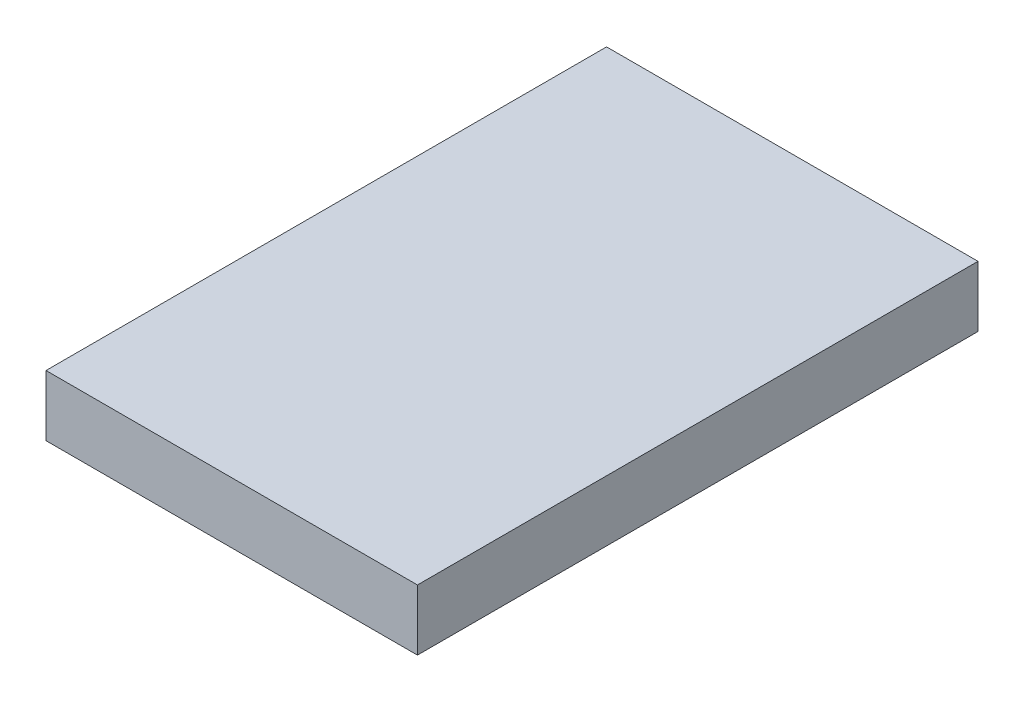
ISO-10303-21;
HEADER;
FILE_DESCRIPTION(('STEP AP214'),'2;1');
FILE_NAME('part.step','',(''),(''),'','','');
FILE_SCHEMA(('AUTOMOTIVE_DESIGN { 1 0 10303 214 1 1 1 1 }'));
ENDSEC;
DATA;
#1=APPLICATION_CONTEXT('core data for automotive mechanical design processes');
#2=APPLICATION_PROTOCOL_DEFINITION('international standard','automotive_design',2000,#1);
#3=PRODUCT_CONTEXT('',#1,'mechanical');
#4=PRODUCT('Part','Part','',(#3));
#5=PRODUCT_RELATED_PRODUCT_CATEGORY('part','',(#4));
#6=PRODUCT_DEFINITION_FORMATION('','',#4);
#7=PRODUCT_DEFINITION_CONTEXT('part definition',#1,'design');
#8=PRODUCT_DEFINITION('design','',#6,#7);
#9=PRODUCT_DEFINITION_SHAPE('','',#8);
#10=(LENGTH_UNIT() NAMED_UNIT(*) SI_UNIT(.MILLI.,.METRE.));
#11=(NAMED_UNIT(*) PLANE_ANGLE_UNIT() SI_UNIT($,.RADIAN.));
#12=(NAMED_UNIT(*) SI_UNIT($,.STERADIAN.) SOLID_ANGLE_UNIT());
#13=UNCERTAINTY_MEASURE_WITH_UNIT(LENGTH_MEASURE(1.E-05),#10,'distance_accuracy_value','');
#14=(GEOMETRIC_REPRESENTATION_CONTEXT(3) GLOBAL_UNCERTAINTY_ASSIGNED_CONTEXT((#13)) GLOBAL_UNIT_ASSIGNED_CONTEXT((#10,
#11,#12)) REPRESENTATION_CONTEXT('',''));
#15=CARTESIAN_POINT('',(0.,0.,0.));
#16=DIRECTION('',(0.,0.,1.));
#17=DIRECTION('',(1.,0.,0.));
#18=AXIS2_PLACEMENT_3D('',#15,#16,#17);
#19=CARTESIAN_POINT('',(27.5,9.,41.5));
#20=DIRECTION('',(-1.,0.,0.));
#21=DIRECTION('',(0.,0.,1.));
#22=AXIS2_PLACEMENT_3D('',#19,#20,#21);
#23=PLANE('',#22);
#24=DIRECTION('',(0.,0.,-1.));
#25=VECTOR('',#24,1.);
#26=CARTESIAN_POINT('',(27.5,0.,41.5));
#27=LINE('',#26,#25);
#28=CARTESIAN_POINT('',(27.5,0.,41.5));
#29=VERTEX_POINT('',#28);
#30=CARTESIAN_POINT('',(27.5,0.,-41.5));
#31=VERTEX_POINT('',#30);
#32=EDGE_CURVE('E101',#29,#31,#27,.T.);
#33=ORIENTED_EDGE('',*,*,#32,.T.);
#34=DIRECTION('',(0.,-1.,0.));
#35=VECTOR('',#34,1.);
#36=CARTESIAN_POINT('',(27.5,9.,-41.5));
#37=LINE('',#36,#35);
#38=CARTESIAN_POINT('',(27.5,9.,-41.5));
#39=VERTEX_POINT('',#38);
#40=EDGE_CURVE('E11',#39,#31,#37,.T.);
#41=ORIENTED_EDGE('',*,*,#40,.F.);
#42=DIRECTION('',(0.,0.,-1.));
#43=VECTOR('',#42,1.);
#44=CARTESIAN_POINT('',(27.5,9.,41.5));
#45=LINE('',#44,#43);
#46=CARTESIAN_POINT('',(27.5,9.,41.5));
#47=VERTEX_POINT('',#46);
#48=EDGE_CURVE('E95',#47,#39,#45,.T.);
#49=ORIENTED_EDGE('',*,*,#48,.F.);
#50=DIRECTION('',(0.,-1.,0.));
#51=VECTOR('',#50,1.);
#52=CARTESIAN_POINT('',(27.5,9.,41.5));
#53=LINE('',#52,#51);
#54=EDGE_CURVE('E99',#47,#29,#53,.T.);
#55=ORIENTED_EDGE('',*,*,#54,.T.);
#56=EDGE_LOOP('',(#33,#41,#49,#55));
#57=FACE_BOUND('',#56,.T.);
#58=ADVANCED_FACE('F41',(#57),#23,.F.);
#59=CARTESIAN_POINT('',(-27.5,9.,-41.5));
#60=DIRECTION('',(0.,0.,1.));
#61=DIRECTION('',(1.,0.,0.));
#62=AXIS2_PLACEMENT_3D('',#59,#60,#61);
#63=PLANE('',#62);
#64=DIRECTION('',(-1.,0.,0.));
#65=VECTOR('',#64,1.);
#66=CARTESIAN_POINT('',(-27.5,0.,-41.5));
#67=LINE('',#66,#65);
#68=CARTESIAN_POINT('',(-27.5,0.,-41.5));
#69=VERTEX_POINT('',#68);
#70=EDGE_CURVE('E96',#31,#69,#67,.T.);
#71=ORIENTED_EDGE('',*,*,#70,.T.);
#72=DIRECTION('',(0.,-1.,0.));
#73=VECTOR('',#72,1.);
#74=CARTESIAN_POINT('',(-27.5,9.,-41.5));
#75=LINE('',#74,#73);
#76=CARTESIAN_POINT('',(-27.5,9.,-41.5));
#77=VERTEX_POINT('',#76);
#78=EDGE_CURVE('E47',#77,#69,#75,.T.);
#79=ORIENTED_EDGE('',*,*,#78,.F.);
#80=DIRECTION('',(-1.,0.,0.));
#81=VECTOR('',#80,1.);
#82=CARTESIAN_POINT('',(-27.5,9.,-41.5));
#83=LINE('',#82,#81);
#84=EDGE_CURVE('E90',#39,#77,#83,.T.);
#85=ORIENTED_EDGE('',*,*,#84,.F.);
#86=ORIENTED_EDGE('',*,*,#40,.T.);
#87=EDGE_LOOP('',(#71,#79,#85,#86));
#88=FACE_BOUND('',#87,.T.);
#89=ADVANCED_FACE('F94',(#88),#63,.F.);
#90=CARTESIAN_POINT('',(-27.5,9.,41.5));
#91=DIRECTION('',(1.,0.,0.));
#92=DIRECTION('',(0.,0.,-1.));
#93=AXIS2_PLACEMENT_3D('',#90,#91,#92);
#94=PLANE('',#93);
#95=DIRECTION('',(0.,0.,1.));
#96=VECTOR('',#95,1.);
#97=CARTESIAN_POINT('',(-27.5,0.,41.5));
#98=LINE('',#97,#96);
#99=CARTESIAN_POINT('',(-27.5,0.,41.5));
#100=VERTEX_POINT('',#99);
#101=EDGE_CURVE('E73',#69,#100,#98,.T.);
#102=ORIENTED_EDGE('',*,*,#101,.T.);
#103=DIRECTION('',(0.,-1.,0.));
#104=VECTOR('',#103,1.);
#105=CARTESIAN_POINT('',(-27.5,9.,41.5));
#106=LINE('',#105,#104);
#107=CARTESIAN_POINT('',(-27.5,9.,41.5));
#108=VERTEX_POINT('',#107);
#109=EDGE_CURVE('E100',#108,#100,#106,.T.);
#110=ORIENTED_EDGE('',*,*,#109,.F.);
#111=DIRECTION('',(0.,0.,1.));
#112=VECTOR('',#111,1.);
#113=CARTESIAN_POINT('',(-27.5,9.,41.5));
#114=LINE('',#113,#112);
#115=EDGE_CURVE('E89',#77,#108,#114,.T.);
#116=ORIENTED_EDGE('',*,*,#115,.F.);
#117=ORIENTED_EDGE('',*,*,#78,.T.);
#118=EDGE_LOOP('',(#102,#110,#116,#117));
#119=FACE_BOUND('',#118,.T.);
#120=ADVANCED_FACE('F97',(#119),#94,.F.);
#121=CARTESIAN_POINT('',(-27.5,9.,41.5));
#122=DIRECTION('',(0.,0.,-1.));
#123=DIRECTION('',(-1.,0.,0.));
#124=AXIS2_PLACEMENT_3D('',#121,#122,#123);
#125=PLANE('',#124);
#126=DIRECTION('',(1.,0.,0.));
#127=VECTOR('',#126,1.);
#128=CARTESIAN_POINT('',(-27.5,0.,41.5));
#129=LINE('',#128,#127);
#130=EDGE_CURVE('E79',#100,#29,#129,.T.);
#131=ORIENTED_EDGE('',*,*,#130,.T.);
#132=ORIENTED_EDGE('',*,*,#54,.F.);
#133=DIRECTION('',(1.,0.,0.));
#134=VECTOR('',#133,1.);
#135=CARTESIAN_POINT('',(-27.5,9.,41.5));
#136=LINE('',#135,#134);
#137=EDGE_CURVE('E60',#108,#47,#136,.T.);
#138=ORIENTED_EDGE('',*,*,#137,.F.);
#139=ORIENTED_EDGE('',*,*,#109,.T.);
#140=EDGE_LOOP('',(#131,#132,#138,#139));
#141=FACE_BOUND('',#140,.T.);
#142=ADVANCED_FACE('F112',(#141),#125,.F.);
#143=CARTESIAN_POINT('',(0.,9.,0.));
#144=DIRECTION('',(0.,-1.,0.));
#145=DIRECTION('',(0.,0.,-1.));
#146=AXIS2_PLACEMENT_3D('',#143,#144,#145);
#147=PLANE('',#146);
#148=ORIENTED_EDGE('',*,*,#48,.T.);
#149=ORIENTED_EDGE('',*,*,#84,.T.);
#150=ORIENTED_EDGE('',*,*,#115,.T.);
#151=ORIENTED_EDGE('',*,*,#137,.T.);
#152=EDGE_LOOP('',(#148,#149,#150,#151));
#153=FACE_BOUND('',#152,.T.);
#154=ADVANCED_FACE('F88',(#153),#147,.F.);
#155=CARTESIAN_POINT('',(0.,0.,0.));
#156=DIRECTION('',(0.,-1.,0.));
#157=DIRECTION('',(0.,0.,-1.));
#158=AXIS2_PLACEMENT_3D('',#155,#156,#157);
#159=PLANE('',#158);
#160=ORIENTED_EDGE('',*,*,#32,.F.);
#161=ORIENTED_EDGE('',*,*,#130,.F.);
#162=ORIENTED_EDGE('',*,*,#101,.F.);
#163=ORIENTED_EDGE('',*,*,#70,.F.);
#164=EDGE_LOOP('',(#160,#161,#162,#163));
#165=FACE_BOUND('',#164,.T.);
#166=ADVANCED_FACE('F114',(#165),#159,.T.);
#167=CLOSED_SHELL('',(#58,#89,#120,#142,#154,#166));
#168=MANIFOLD_SOLID_BREP('B2',#167);
#169=ADVANCED_BREP_SHAPE_REPRESENTATION('',(#18,#168),#14);
#170=SHAPE_DEFINITION_REPRESENTATION(#9,#169);
ENDSEC;
END-ISO-10303-21;
